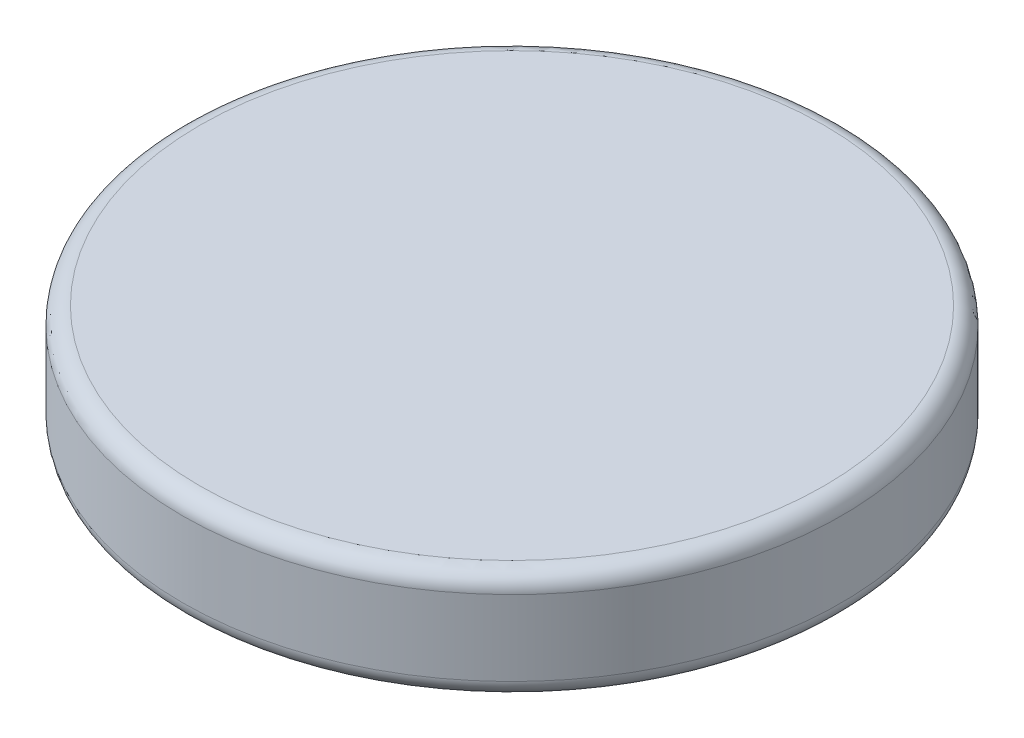
ISO-10303-21;
HEADER;
FILE_DESCRIPTION(('STEP AP214'),'2;1');
FILE_NAME('part.step','',(''),(''),'','','');
FILE_SCHEMA(('AUTOMOTIVE_DESIGN { 1 0 10303 214 1 1 1 1 }'));
ENDSEC;
DATA;
#1=APPLICATION_CONTEXT('core data for automotive mechanical design processes');
#2=APPLICATION_PROTOCOL_DEFINITION('international standard','automotive_design',2000,#1);
#3=PRODUCT_CONTEXT('',#1,'mechanical');
#4=PRODUCT('Part','Part','',(#3));
#5=PRODUCT_RELATED_PRODUCT_CATEGORY('part','',(#4));
#6=PRODUCT_DEFINITION_FORMATION('','',#4);
#7=PRODUCT_DEFINITION_CONTEXT('part definition',#1,'design');
#8=PRODUCT_DEFINITION('design','',#6,#7);
#9=PRODUCT_DEFINITION_SHAPE('','',#8);
#10=(LENGTH_UNIT() NAMED_UNIT(*) SI_UNIT(.MILLI.,.METRE.));
#11=(NAMED_UNIT(*) PLANE_ANGLE_UNIT() SI_UNIT($,.RADIAN.));
#12=(NAMED_UNIT(*) SI_UNIT($,.STERADIAN.) SOLID_ANGLE_UNIT());
#13=UNCERTAINTY_MEASURE_WITH_UNIT(LENGTH_MEASURE(1.E-05),#10,'distance_accuracy_value','');
#14=(GEOMETRIC_REPRESENTATION_CONTEXT(3) GLOBAL_UNCERTAINTY_ASSIGNED_CONTEXT((#13)) GLOBAL_UNIT_ASSIGNED_CONTEXT((#10,
#11,#12)) REPRESENTATION_CONTEXT('',''));
#15=CARTESIAN_POINT('',(0.,0.,0.));
#16=DIRECTION('',(0.,0.,1.));
#17=DIRECTION('',(1.,0.,0.));
#18=AXIS2_PLACEMENT_3D('',#15,#16,#17);
#19=CARTESIAN_POINT('',(0.,1.5875,0.));
#20=DIRECTION('',(0.,-1.,0.));
#21=DIRECTION('',(0.,0.,-1.));
#22=AXIS2_PLACEMENT_3D('',#19,#20,#21);
#23=CYLINDRICAL_SURFACE('',#22,4.7625);
#24=CARTESIAN_POINT('',(0.,0.25,0.));
#25=DIRECTION('',(0.,1.,0.));
#26=DIRECTION('',(0.,0.,1.));
#27=AXIS2_PLACEMENT_3D('',#24,#25,#26);
#28=CIRCLE('',#27,4.7625);
#29=CARTESIAN_POINT('',(0.,0.25,4.7625));
#30=VERTEX_POINT('',#29);
#31=EDGE_CURVE('E54',#30,#30,#28,.T.);
#32=ORIENTED_EDGE('',*,*,#31,.T.);
#33=EDGE_LOOP('',(#32));
#34=FACE_BOUND('',#33,.T.);
#35=CARTESIAN_POINT('',(0.,1.3375,0.));
#36=DIRECTION('',(0.,1.,0.));
#37=DIRECTION('',(0.,0.,1.));
#38=AXIS2_PLACEMENT_3D('',#35,#36,#37);
#39=CIRCLE('',#38,4.7625);
#40=CARTESIAN_POINT('',(0.,1.3375,4.7625));
#41=VERTEX_POINT('',#40);
#42=EDGE_CURVE('E59',#41,#41,#39,.F.);
#43=ORIENTED_EDGE('',*,*,#42,.T.);
#44=EDGE_LOOP('',(#43));
#45=FACE_BOUND('',#44,.T.);
#46=ADVANCED_FACE('F41',(#34,#45),#23,.T.);
#47=CARTESIAN_POINT('',(0.,1.5875,0.));
#48=DIRECTION('',(0.,1.,0.));
#49=DIRECTION('',(0.,0.,1.));
#50=AXIS2_PLACEMENT_3D('',#47,#48,#49);
#51=PLANE('',#50);
#52=CARTESIAN_POINT('',(0.,1.5875,0.));
#53=DIRECTION('',(0.,1.,0.));
#54=DIRECTION('',(0.,0.,1.));
#55=AXIS2_PLACEMENT_3D('',#52,#53,#54);
#56=CIRCLE('',#55,4.5125);
#57=CARTESIAN_POINT('',(0.,1.5875,4.5125));
#58=VERTEX_POINT('',#57);
#59=EDGE_CURVE('E10',#58,#58,#56,.T.);
#60=ORIENTED_EDGE('',*,*,#59,.T.);
#61=EDGE_LOOP('',(#60));
#62=FACE_BOUND('',#61,.T.);
#63=ADVANCED_FACE('F76',(#62),#51,.T.);
#64=CARTESIAN_POINT('',(0.,0.,0.));
#65=DIRECTION('',(0.,1.,0.));
#66=DIRECTION('',(0.,0.,1.));
#67=AXIS2_PLACEMENT_3D('',#64,#65,#66);
#68=PLANE('',#67);
#69=CARTESIAN_POINT('',(0.,0.,0.));
#70=DIRECTION('',(0.,1.,0.));
#71=DIRECTION('',(0.,0.,1.));
#72=AXIS2_PLACEMENT_3D('',#69,#70,#71);
#73=CIRCLE('',#72,4.5125);
#74=CARTESIAN_POINT('',(0.,0.,4.5125));
#75=VERTEX_POINT('',#74);
#76=EDGE_CURVE('E49',#75,#75,#73,.F.);
#77=ORIENTED_EDGE('',*,*,#76,.T.);
#78=EDGE_LOOP('',(#77));
#79=FACE_BOUND('',#78,.T.);
#80=ADVANCED_FACE('F73',(#79),#68,.F.);
#81=CARTESIAN_POINT('',(0.,0.25,0.));
#82=DIRECTION('',(0.,1.,0.));
#83=DIRECTION('',(0.,0.,1.));
#84=AXIS2_PLACEMENT_3D('',#81,#82,#83);
#85=TOROIDAL_SURFACE('',#84,4.5125,0.25);
#86=ORIENTED_EDGE('',*,*,#76,.F.);
#87=EDGE_LOOP('',(#86));
#88=FACE_BOUND('',#87,.T.);
#89=ORIENTED_EDGE('',*,*,#31,.F.);
#90=EDGE_LOOP('',(#89));
#91=FACE_BOUND('',#90,.T.);
#92=ADVANCED_FACE('F69',(#88,#91),#85,.T.);
#93=CARTESIAN_POINT('',(0.,1.3375,0.));
#94=DIRECTION('',(0.,1.,0.));
#95=DIRECTION('',(0.,0.,1.));
#96=AXIS2_PLACEMENT_3D('',#93,#94,#95);
#97=TOROIDAL_SURFACE('',#96,4.5125,0.25);
#98=ORIENTED_EDGE('',*,*,#42,.F.);
#99=EDGE_LOOP('',(#98));
#100=FACE_BOUND('',#99,.T.);
#101=ORIENTED_EDGE('',*,*,#59,.F.);
#102=EDGE_LOOP('',(#101));
#103=FACE_BOUND('',#102,.T.);
#104=ADVANCED_FACE('F43',(#100,#103),#97,.T.);
#105=CLOSED_SHELL('',(#46,#63,#80,#92,#104));
#106=MANIFOLD_SOLID_BREP('B2',#105);
#107=ADVANCED_BREP_SHAPE_REPRESENTATION('',(#18,#106),#14);
#108=SHAPE_DEFINITION_REPRESENTATION(#9,#107);
ENDSEC;
END-ISO-10303-21;
